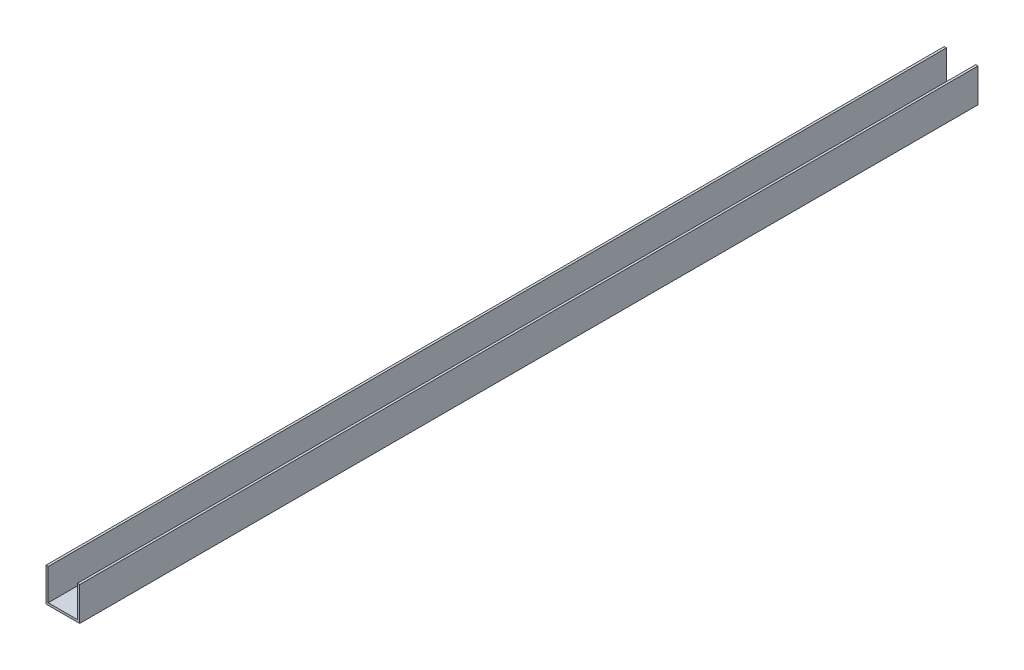
ISO-10303-21;
HEADER;
FILE_DESCRIPTION(('STEP AP214'),'2;1');
FILE_NAME('part.step','',(''),(''),'','','');
FILE_SCHEMA(('AUTOMOTIVE_DESIGN { 1 0 10303 214 1 1 1 1 }'));
ENDSEC;
DATA;
#1=APPLICATION_CONTEXT('core data for automotive mechanical design processes');
#2=APPLICATION_PROTOCOL_DEFINITION('international standard','automotive_design',2000,#1);
#3=PRODUCT_CONTEXT('',#1,'mechanical');
#4=PRODUCT('Part','Part','',(#3));
#5=PRODUCT_RELATED_PRODUCT_CATEGORY('part','',(#4));
#6=PRODUCT_DEFINITION_FORMATION('','',#4);
#7=PRODUCT_DEFINITION_CONTEXT('part definition',#1,'design');
#8=PRODUCT_DEFINITION('design','',#6,#7);
#9=PRODUCT_DEFINITION_SHAPE('','',#8);
#10=(LENGTH_UNIT() NAMED_UNIT(*) SI_UNIT(.MILLI.,.METRE.));
#11=(NAMED_UNIT(*) PLANE_ANGLE_UNIT() SI_UNIT($,.RADIAN.));
#12=(NAMED_UNIT(*) SI_UNIT($,.STERADIAN.) SOLID_ANGLE_UNIT());
#13=UNCERTAINTY_MEASURE_WITH_UNIT(LENGTH_MEASURE(1.E-05),#10,'distance_accuracy_value','');
#14=(GEOMETRIC_REPRESENTATION_CONTEXT(3) GLOBAL_UNCERTAINTY_ASSIGNED_CONTEXT((#13)) GLOBAL_UNIT_ASSIGNED_CONTEXT((#10,
#11,#12)) REPRESENTATION_CONTEXT('',''));
#15=CARTESIAN_POINT('',(0.,0.,0.));
#16=DIRECTION('',(0.,0.,1.));
#17=DIRECTION('',(1.,0.,0.));
#18=AXIS2_PLACEMENT_3D('',#15,#16,#17);
#19=CARTESIAN_POINT('',(7.,0.,0.));
#20=DIRECTION('',(0.,0.,1.));
#21=DIRECTION('',(0.,1.,0.));
#22=AXIS2_PLACEMENT_3D('',#19,#20,#21);
#23=PLANE('',#22);
#24=DIRECTION('',(0.,1.,0.));
#25=VECTOR('',#24,1.);
#26=CARTESIAN_POINT('',(6.5,0.,0.));
#27=LINE('',#26,#25);
#28=CARTESIAN_POINT('',(6.5,0.5,0.));
#29=VERTEX_POINT('',#28);
#30=CARTESIAN_POINT('',(6.5,14.5,0.));
#31=VERTEX_POINT('',#30);
#32=EDGE_CURVE('E186',#29,#31,#27,.T.);
#33=ORIENTED_EDGE('',*,*,#32,.F.);
#34=DIRECTION('',(1.,0.,0.));
#35=VECTOR('',#34,1.);
#36=CARTESIAN_POINT('',(-7.,0.5,0.));
#37=LINE('',#36,#35);
#38=CARTESIAN_POINT('',(-6.5,0.5,0.));
#39=VERTEX_POINT('',#38);
#40=EDGE_CURVE('E194',#39,#29,#37,.T.);
#41=ORIENTED_EDGE('',*,*,#40,.F.);
#42=DIRECTION('',(0.,1.,0.));
#43=VECTOR('',#42,1.);
#44=CARTESIAN_POINT('',(-6.5,0.,0.));
#45=LINE('',#44,#43);
#46=CARTESIAN_POINT('',(-6.5,14.5,0.));
#47=VERTEX_POINT('',#46);
#48=EDGE_CURVE('E98',#47,#39,#45,.F.);
#49=ORIENTED_EDGE('',*,*,#48,.F.);
#50=DIRECTION('',(1.,0.,0.));
#51=VECTOR('',#50,1.);
#52=CARTESIAN_POINT('',(-7.,14.5,0.));
#53=LINE('',#52,#51);
#54=CARTESIAN_POINT('',(-7.5,14.5,0.));
#55=VERTEX_POINT('',#54);
#56=EDGE_CURVE('E11',#55,#47,#53,.T.);
#57=ORIENTED_EDGE('',*,*,#56,.F.);
#58=DIRECTION('',(0.,1.,0.));
#59=VECTOR('',#58,1.);
#60=CARTESIAN_POINT('',(-7.5,0.,0.));
#61=LINE('',#60,#59);
#62=CARTESIAN_POINT('',(-7.5,-0.5,0.));
#63=VERTEX_POINT('',#62);
#64=EDGE_CURVE('E96',#55,#63,#61,.F.);
#65=ORIENTED_EDGE('',*,*,#64,.T.);
#66=DIRECTION('',(1.,0.,0.));
#67=VECTOR('',#66,1.);
#68=CARTESIAN_POINT('',(-7.,-0.5,0.));
#69=LINE('',#68,#67);
#70=CARTESIAN_POINT('',(7.5,-0.5,0.));
#71=VERTEX_POINT('',#70);
#72=EDGE_CURVE('E152',#63,#71,#69,.T.);
#73=ORIENTED_EDGE('',*,*,#72,.T.);
#74=DIRECTION('',(0.,1.,0.));
#75=VECTOR('',#74,1.);
#76=CARTESIAN_POINT('',(7.5,0.,0.));
#77=LINE('',#76,#75);
#78=CARTESIAN_POINT('',(7.5,14.5,0.));
#79=VERTEX_POINT('',#78);
#80=EDGE_CURVE('E149',#71,#79,#77,.T.);
#81=ORIENTED_EDGE('',*,*,#80,.T.);
#82=DIRECTION('',(-1.,0.,0.));
#83=VECTOR('',#82,1.);
#84=CARTESIAN_POINT('',(7.,14.5,0.));
#85=LINE('',#84,#83);
#86=EDGE_CURVE('E48',#79,#31,#85,.T.);
#87=ORIENTED_EDGE('',*,*,#86,.T.);
#88=EDGE_LOOP('',(#33,#41,#49,#57,#65,#73,#81,#87));
#89=FACE_BOUND('',#88,.T.);
#90=ADVANCED_FACE('F38',(#89),#23,.T.);
#91=CARTESIAN_POINT('',(7.,14.5,0.));
#92=DIRECTION('',(0.,1.,0.));
#93=DIRECTION('',(0.,0.,-1.));
#94=AXIS2_PLACEMENT_3D('',#91,#92,#93);
#95=PLANE('',#94);
#96=ORIENTED_EDGE('',*,*,#86,.F.);
#97=DIRECTION('',(0.,0.,1.));
#98=VECTOR('',#97,1.);
#99=CARTESIAN_POINT('',(7.5,14.5,0.));
#100=LINE('',#99,#98);
#101=CARTESIAN_POINT('',(7.5,14.5,-400.));
#102=VERTEX_POINT('',#101);
#103=EDGE_CURVE('E147',#79,#102,#100,.F.);
#104=ORIENTED_EDGE('',*,*,#103,.T.);
#105=DIRECTION('',(-1.,0.,0.));
#106=VECTOR('',#105,1.);
#107=CARTESIAN_POINT('',(7.,14.5,-400.));
#108=LINE('',#107,#106);
#109=CARTESIAN_POINT('',(6.5,14.5,-400.));
#110=VERTEX_POINT('',#109);
#111=EDGE_CURVE('E124',#102,#110,#108,.T.);
#112=ORIENTED_EDGE('',*,*,#111,.T.);
#113=DIRECTION('',(0.,0.,1.));
#114=VECTOR('',#113,1.);
#115=CARTESIAN_POINT('',(6.5,14.5,0.));
#116=LINE('',#115,#114);
#117=EDGE_CURVE('E182',#31,#110,#116,.F.);
#118=ORIENTED_EDGE('',*,*,#117,.F.);
#119=EDGE_LOOP('',(#96,#104,#112,#118));
#120=FACE_BOUND('',#119,.T.);
#121=ADVANCED_FACE('F181',(#120),#95,.T.);
#122=CARTESIAN_POINT('',(-7.,0.,-400.));
#123=DIRECTION('',(0.,0.,1.));
#124=DIRECTION('',(0.,-1.,0.));
#125=AXIS2_PLACEMENT_3D('',#122,#123,#124);
#126=PLANE('',#125);
#127=DIRECTION('',(0.,1.,0.));
#128=VECTOR('',#127,1.);
#129=CARTESIAN_POINT('',(-6.5,0.,-400.));
#130=LINE('',#129,#128);
#131=CARTESIAN_POINT('',(-6.5,14.5,-400.));
#132=VERTEX_POINT('',#131);
#133=CARTESIAN_POINT('',(-6.5,0.5,-400.));
#134=VERTEX_POINT('',#133);
#135=EDGE_CURVE('E139',#132,#134,#130,.F.);
#136=ORIENTED_EDGE('',*,*,#135,.T.);
#137=DIRECTION('',(1.,0.,0.));
#138=VECTOR('',#137,1.);
#139=CARTESIAN_POINT('',(-7.,0.5,-400.));
#140=LINE('',#139,#138);
#141=CARTESIAN_POINT('',(6.5,0.5,-400.));
#142=VERTEX_POINT('',#141);
#143=EDGE_CURVE('E185',#134,#142,#140,.T.);
#144=ORIENTED_EDGE('',*,*,#143,.T.);
#145=DIRECTION('',(0.,1.,0.));
#146=VECTOR('',#145,1.);
#147=CARTESIAN_POINT('',(6.5,0.,-400.));
#148=LINE('',#147,#146);
#149=EDGE_CURVE('E113',#142,#110,#148,.T.);
#150=ORIENTED_EDGE('',*,*,#149,.T.);
#151=ORIENTED_EDGE('',*,*,#111,.F.);
#152=DIRECTION('',(0.,1.,0.));
#153=VECTOR('',#152,1.);
#154=CARTESIAN_POINT('',(7.5,0.,-400.));
#155=LINE('',#154,#153);
#156=CARTESIAN_POINT('',(7.5,-0.5,-400.));
#157=VERTEX_POINT('',#156);
#158=EDGE_CURVE('E157',#157,#102,#155,.T.);
#159=ORIENTED_EDGE('',*,*,#158,.F.);
#160=DIRECTION('',(1.,0.,0.));
#161=VECTOR('',#160,1.);
#162=CARTESIAN_POINT('',(-7.,-0.5,-400.));
#163=LINE('',#162,#161);
#164=CARTESIAN_POINT('',(-7.5,-0.5,-400.));
#165=VERTEX_POINT('',#164);
#166=EDGE_CURVE('E148',#165,#157,#163,.T.);
#167=ORIENTED_EDGE('',*,*,#166,.F.);
#168=DIRECTION('',(0.,1.,0.));
#169=VECTOR('',#168,1.);
#170=CARTESIAN_POINT('',(-7.5,0.,-400.));
#171=LINE('',#170,#169);
#172=CARTESIAN_POINT('',(-7.5,14.5,-400.));
#173=VERTEX_POINT('',#172);
#174=EDGE_CURVE('E108',#173,#165,#171,.F.);
#175=ORIENTED_EDGE('',*,*,#174,.F.);
#176=DIRECTION('',(1.,0.,0.));
#177=VECTOR('',#176,1.);
#178=CARTESIAN_POINT('',(-7.,14.5,-400.));
#179=LINE('',#178,#177);
#180=EDGE_CURVE('E42',#173,#132,#179,.T.);
#181=ORIENTED_EDGE('',*,*,#180,.T.);
#182=EDGE_LOOP('',(#136,#144,#150,#151,#159,#167,#175,#181));
#183=FACE_BOUND('',#182,.T.);
#184=ADVANCED_FACE('F214',(#183),#126,.F.);
#185=CARTESIAN_POINT('',(-7.,14.5,0.));
#186=DIRECTION('',(0.,-1.,0.));
#187=DIRECTION('',(0.,0.,-1.));
#188=AXIS2_PLACEMENT_3D('',#185,#186,#187);
#189=PLANE('',#188);
#190=DIRECTION('',(0.,0.,-1.));
#191=VECTOR('',#190,1.);
#192=CARTESIAN_POINT('',(-7.5,14.5,0.));
#193=LINE('',#192,#191);
#194=EDGE_CURVE('E104',#55,#173,#193,.T.);
#195=ORIENTED_EDGE('',*,*,#194,.F.);
#196=ORIENTED_EDGE('',*,*,#56,.T.);
#197=DIRECTION('',(0.,0.,-1.));
#198=VECTOR('',#197,1.);
#199=CARTESIAN_POINT('',(-6.5,14.5,0.));
#200=LINE('',#199,#198);
#201=EDGE_CURVE('E134',#47,#132,#200,.T.);
#202=ORIENTED_EDGE('',*,*,#201,.T.);
#203=ORIENTED_EDGE('',*,*,#180,.F.);
#204=EDGE_LOOP('',(#195,#196,#202,#203));
#205=FACE_BOUND('',#204,.T.);
#206=ADVANCED_FACE('F40',(#205),#189,.F.);
#207=CARTESIAN_POINT('',(-6.5,0.,0.));
#208=DIRECTION('',(1.,0.,0.));
#209=DIRECTION('',(0.,0.,-1.));
#210=AXIS2_PLACEMENT_3D('',#207,#208,#209);
#211=PLANE('',#210);
#212=ORIENTED_EDGE('',*,*,#135,.F.);
#213=ORIENTED_EDGE('',*,*,#201,.F.);
#214=ORIENTED_EDGE('',*,*,#48,.T.);
#215=DIRECTION('',(0.,0.,-1.));
#216=VECTOR('',#215,1.);
#217=CARTESIAN_POINT('',(-6.5,0.5,0.));
#218=LINE('',#217,#216);
#219=EDGE_CURVE('E189',#39,#134,#218,.T.);
#220=ORIENTED_EDGE('',*,*,#219,.T.);
#221=EDGE_LOOP('',(#212,#213,#214,#220));
#222=FACE_BOUND('',#221,.T.);
#223=ADVANCED_FACE('F216',(#222),#211,.T.);
#224=CARTESIAN_POINT('',(-7.,0.5,0.));
#225=DIRECTION('',(0.,1.,0.));
#226=DIRECTION('',(0.,0.,1.));
#227=AXIS2_PLACEMENT_3D('',#224,#225,#226);
#228=PLANE('',#227);
#229=ORIENTED_EDGE('',*,*,#143,.F.);
#230=ORIENTED_EDGE('',*,*,#219,.F.);
#231=ORIENTED_EDGE('',*,*,#40,.T.);
#232=DIRECTION('',(0.,0.,-1.));
#233=VECTOR('',#232,1.);
#234=CARTESIAN_POINT('',(6.5,0.5,0.));
#235=LINE('',#234,#233);
#236=EDGE_CURVE('E116',#29,#142,#235,.T.);
#237=ORIENTED_EDGE('',*,*,#236,.T.);
#238=EDGE_LOOP('',(#229,#230,#231,#237));
#239=FACE_BOUND('',#238,.T.);
#240=ADVANCED_FACE('F211',(#239),#228,.T.);
#241=CARTESIAN_POINT('',(6.5,0.,0.));
#242=DIRECTION('',(-1.,0.,0.));
#243=DIRECTION('',(0.,0.,1.));
#244=AXIS2_PLACEMENT_3D('',#241,#242,#243);
#245=PLANE('',#244);
#246=ORIENTED_EDGE('',*,*,#149,.F.);
#247=ORIENTED_EDGE('',*,*,#236,.F.);
#248=ORIENTED_EDGE('',*,*,#32,.T.);
#249=ORIENTED_EDGE('',*,*,#117,.T.);
#250=EDGE_LOOP('',(#246,#247,#248,#249));
#251=FACE_BOUND('',#250,.T.);
#252=ADVANCED_FACE('F213',(#251),#245,.T.);
#253=CARTESIAN_POINT('',(-7.5,0.,0.));
#254=DIRECTION('',(1.,0.,0.));
#255=DIRECTION('',(0.,0.,-1.));
#256=AXIS2_PLACEMENT_3D('',#253,#254,#255);
#257=PLANE('',#256);
#258=ORIENTED_EDGE('',*,*,#174,.T.);
#259=DIRECTION('',(0.,0.,-1.));
#260=VECTOR('',#259,1.);
#261=CARTESIAN_POINT('',(-7.5,-0.5,0.));
#262=LINE('',#261,#260);
#263=EDGE_CURVE('E111',#63,#165,#262,.T.);
#264=ORIENTED_EDGE('',*,*,#263,.F.);
#265=ORIENTED_EDGE('',*,*,#64,.F.);
#266=ORIENTED_EDGE('',*,*,#194,.T.);
#267=EDGE_LOOP('',(#258,#264,#265,#266));
#268=FACE_BOUND('',#267,.T.);
#269=ADVANCED_FACE('F110',(#268),#257,.F.);
#270=CARTESIAN_POINT('',(-7.,-0.5,0.));
#271=DIRECTION('',(0.,1.,0.));
#272=DIRECTION('',(0.,0.,1.));
#273=AXIS2_PLACEMENT_3D('',#270,#271,#272);
#274=PLANE('',#273);
#275=ORIENTED_EDGE('',*,*,#166,.T.);
#276=DIRECTION('',(0.,0.,-1.));
#277=VECTOR('',#276,1.);
#278=CARTESIAN_POINT('',(7.5,-0.5,0.));
#279=LINE('',#278,#277);
#280=EDGE_CURVE('E155',#71,#157,#279,.T.);
#281=ORIENTED_EDGE('',*,*,#280,.F.);
#282=ORIENTED_EDGE('',*,*,#72,.F.);
#283=ORIENTED_EDGE('',*,*,#263,.T.);
#284=EDGE_LOOP('',(#275,#281,#282,#283));
#285=FACE_BOUND('',#284,.T.);
#286=ADVANCED_FACE('F175',(#285),#274,.F.);
#287=CARTESIAN_POINT('',(7.5,0.,0.));
#288=DIRECTION('',(-1.,0.,0.));
#289=DIRECTION('',(0.,0.,1.));
#290=AXIS2_PLACEMENT_3D('',#287,#288,#289);
#291=PLANE('',#290);
#292=ORIENTED_EDGE('',*,*,#158,.T.);
#293=ORIENTED_EDGE('',*,*,#103,.F.);
#294=ORIENTED_EDGE('',*,*,#80,.F.);
#295=ORIENTED_EDGE('',*,*,#280,.T.);
#296=EDGE_LOOP('',(#292,#293,#294,#295));
#297=FACE_BOUND('',#296,.T.);
#298=ADVANCED_FACE('F180',(#297),#291,.F.);
#299=CLOSED_SHELL('',(#90,#121,#184,#206,#223,#240,#252,#269,#286,#298));
#300=MANIFOLD_SOLID_BREP('B2',#299);
#301=ADVANCED_BREP_SHAPE_REPRESENTATION('',(#18,#300),#14);
#302=SHAPE_DEFINITION_REPRESENTATION(#9,#301);
ENDSEC;
END-ISO-10303-21;
